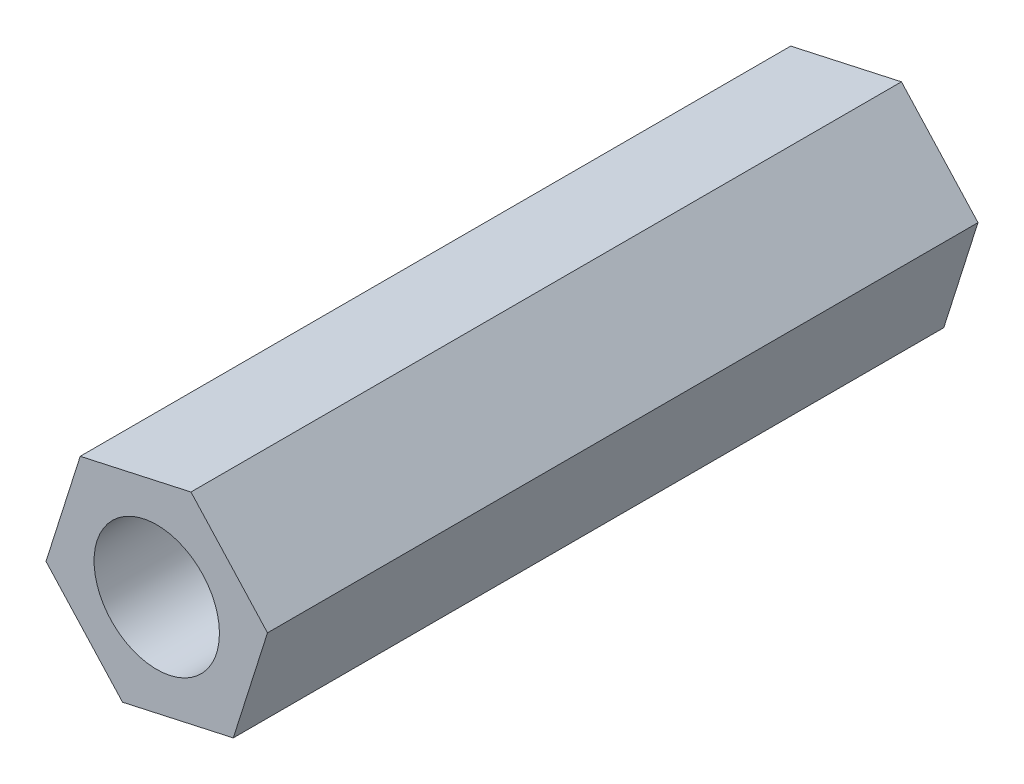
ISO-10303-21;
HEADER;
FILE_DESCRIPTION(('STEP AP214'),'2;1');
FILE_NAME('part.step','',(''),(''),'','','');
FILE_SCHEMA(('AUTOMOTIVE_DESIGN { 1 0 10303 214 1 1 1 1 }'));
ENDSEC;
DATA;
#1=APPLICATION_CONTEXT('core data for automotive mechanical design processes');
#2=APPLICATION_PROTOCOL_DEFINITION('international standard','automotive_design',2000,#1);
#3=PRODUCT_CONTEXT('',#1,'mechanical');
#4=PRODUCT('Part','Part','',(#3));
#5=PRODUCT_RELATED_PRODUCT_CATEGORY('part','',(#4));
#6=PRODUCT_DEFINITION_FORMATION('','',#4);
#7=PRODUCT_DEFINITION_CONTEXT('part definition',#1,'design');
#8=PRODUCT_DEFINITION('design','',#6,#7);
#9=PRODUCT_DEFINITION_SHAPE('','',#8);
#10=(LENGTH_UNIT() NAMED_UNIT(*) SI_UNIT(.MILLI.,.METRE.));
#11=(NAMED_UNIT(*) PLANE_ANGLE_UNIT() SI_UNIT($,.RADIAN.));
#12=(NAMED_UNIT(*) SI_UNIT($,.STERADIAN.) SOLID_ANGLE_UNIT());
#13=UNCERTAINTY_MEASURE_WITH_UNIT(LENGTH_MEASURE(1.E-05),#10,'distance_accuracy_value','');
#14=(GEOMETRIC_REPRESENTATION_CONTEXT(3) GLOBAL_UNCERTAINTY_ASSIGNED_CONTEXT((#13)) GLOBAL_UNIT_ASSIGNED_CONTEXT((#10,
#11,#12)) REPRESENTATION_CONTEXT('',''));
#15=CARTESIAN_POINT('',(0.,0.,0.));
#16=DIRECTION('',(0.,0.,1.));
#17=DIRECTION('',(1.,0.,0.));
#18=AXIS2_PLACEMENT_3D('',#15,#16,#17);
#19=CARTESIAN_POINT('',(0.,0.,17.));
#20=DIRECTION('',(0.,0.,1.));
#21=DIRECTION('',(1.,0.,0.));
#22=AXIS2_PLACEMENT_3D('',#19,#20,#21);
#23=PLANE('',#22);
#24=DIRECTION('',(0.301648882780597,0.953419084934436,0.));
#25=VECTOR('',#24,1.);
#26=CARTESIAN_POINT('',(1.83126574996171,-2.00244827307736,17.));
#27=LINE('',#26,#25);
#28=CARTESIAN_POINT('',(1.83126574996171,-2.00244827307736,17.));
#29=VERTEX_POINT('',#28);
#30=CARTESIAN_POINT('',(2.64980394923012,0.584698524008543,17.));
#31=VERTEX_POINT('',#30);
#32=EDGE_CURVE('E132',#29,#31,#27,.T.);
#33=ORIENTED_EDGE('',*,*,#32,.T.);
#34=DIRECTION('',(-0.674860706615837,0.737945137978409,0.));
#35=VECTOR('',#34,1.);
#36=CARTESIAN_POINT('',(2.64980394923012,0.584698524008543,17.));
#37=LINE('',#36,#35);
#38=CARTESIAN_POINT('',(0.818538199268401,2.58714679708588,17.));
#39=VERTEX_POINT('',#38);
#40=EDGE_CURVE('E90',#31,#39,#37,.T.);
#41=ORIENTED_EDGE('',*,*,#40,.T.);
#42=DIRECTION('',(-0.976509589396434,-0.215473946956026,0.));
#43=VECTOR('',#42,1.);
#44=CARTESIAN_POINT('',(0.818538199268401,2.58714679708588,17.));
#45=LINE('',#44,#43);
#46=CARTESIAN_POINT('',(-1.8312657499617,2.00244827307734,17.));
#47=VERTEX_POINT('',#46);
#48=EDGE_CURVE('E103',#39,#47,#45,.T.);
#49=ORIENTED_EDGE('',*,*,#48,.T.);
#50=DIRECTION('',(-0.301648882780597,-0.953419084934436,0.));
#51=VECTOR('',#50,1.);
#52=CARTESIAN_POINT('',(-1.8312657499617,2.00244827307734,17.));
#53=LINE('',#52,#51);
#54=CARTESIAN_POINT('',(-2.6498039492301,-0.584698524008529,17.));
#55=VERTEX_POINT('',#54);
#56=EDGE_CURVE('E97',#47,#55,#53,.T.);
#57=ORIENTED_EDGE('',*,*,#56,.T.);
#58=DIRECTION('',(0.674860706615837,-0.737945137978409,0.));
#59=VECTOR('',#58,1.);
#60=CARTESIAN_POINT('',(-2.6498039492301,-0.584698524008529,17.));
#61=LINE('',#60,#59);
#62=CARTESIAN_POINT('',(-0.818538199268357,-2.58714679708589,17.));
#63=VERTEX_POINT('',#62);
#64=EDGE_CURVE('E101',#55,#63,#61,.T.);
#65=ORIENTED_EDGE('',*,*,#64,.T.);
#66=DIRECTION('',(0.976509589396434,0.215473946956027,0.));
#67=VECTOR('',#66,1.);
#68=CARTESIAN_POINT('',(-0.818538199268357,-2.58714679708589,17.));
#69=LINE('',#68,#67);
#70=EDGE_CURVE('E53',#63,#29,#69,.T.);
#71=ORIENTED_EDGE('',*,*,#70,.T.);
#72=EDGE_LOOP('',(#33,#41,#49,#57,#65,#71));
#73=FACE_BOUND('',#72,.T.);
#74=CARTESIAN_POINT('',(0.,0.,17.));
#75=DIRECTION('',(0.,0.,1.));
#76=DIRECTION('',(1.,0.,0.));
#77=AXIS2_PLACEMENT_3D('',#74,#75,#76);
#78=CIRCLE('',#77,1.5);
#79=CARTESIAN_POINT('',(1.5,0.,17.));
#80=VERTEX_POINT('',#79);
#81=EDGE_CURVE('E125',#80,#80,#78,.T.);
#82=ORIENTED_EDGE('',*,*,#81,.F.);
#83=EDGE_LOOP('',(#82));
#84=FACE_BOUND('',#83,.T.);
#85=ADVANCED_FACE('F36',(#73,#84),#23,.T.);
#86=CARTESIAN_POINT('',(0.,0.,0.));
#87=DIRECTION('',(0.,0.,1.));
#88=DIRECTION('',(1.,0.,0.));
#89=AXIS2_PLACEMENT_3D('',#86,#87,#88);
#90=PLANE('',#89);
#91=DIRECTION('',(0.301648882780597,0.953419084934436,0.));
#92=VECTOR('',#91,1.);
#93=CARTESIAN_POINT('',(1.83126574996171,-2.00244827307736,0.));
#94=LINE('',#93,#92);
#95=CARTESIAN_POINT('',(1.83126574996171,-2.00244827307736,0.));
#96=VERTEX_POINT('',#95);
#97=CARTESIAN_POINT('',(2.64980394923012,0.584698524008543,0.));
#98=VERTEX_POINT('',#97);
#99=EDGE_CURVE('E121',#96,#98,#94,.T.);
#100=ORIENTED_EDGE('',*,*,#99,.F.);
#101=DIRECTION('',(0.976509589396434,0.215473946956027,0.));
#102=VECTOR('',#101,1.);
#103=CARTESIAN_POINT('',(-0.818538199268357,-2.58714679708589,0.));
#104=LINE('',#103,#102);
#105=CARTESIAN_POINT('',(-0.818538199268357,-2.58714679708589,0.));
#106=VERTEX_POINT('',#105);
#107=EDGE_CURVE('E82',#106,#96,#104,.T.);
#108=ORIENTED_EDGE('',*,*,#107,.F.);
#109=DIRECTION('',(0.674860706615837,-0.737945137978409,0.));
#110=VECTOR('',#109,1.);
#111=CARTESIAN_POINT('',(-2.6498039492301,-0.584698524008529,0.));
#112=LINE('',#111,#110);
#113=CARTESIAN_POINT('',(-2.6498039492301,-0.584698524008529,0.));
#114=VERTEX_POINT('',#113);
#115=EDGE_CURVE('E76',#114,#106,#112,.T.);
#116=ORIENTED_EDGE('',*,*,#115,.F.);
#117=DIRECTION('',(-0.301648882780597,-0.953419084934436,0.));
#118=VECTOR('',#117,1.);
#119=CARTESIAN_POINT('',(-1.8312657499617,2.00244827307734,0.));
#120=LINE('',#119,#118);
#121=CARTESIAN_POINT('',(-1.8312657499617,2.00244827307734,0.));
#122=VERTEX_POINT('',#121);
#123=EDGE_CURVE('E111',#122,#114,#120,.T.);
#124=ORIENTED_EDGE('',*,*,#123,.F.);
#125=DIRECTION('',(-0.976509589396434,-0.215473946956026,0.));
#126=VECTOR('',#125,1.);
#127=CARTESIAN_POINT('',(0.818538199268401,2.58714679708588,0.));
#128=LINE('',#127,#126);
#129=CARTESIAN_POINT('',(0.818538199268401,2.58714679708588,0.));
#130=VERTEX_POINT('',#129);
#131=EDGE_CURVE('E127',#130,#122,#128,.T.);
#132=ORIENTED_EDGE('',*,*,#131,.F.);
#133=DIRECTION('',(-0.674860706615837,0.737945137978409,0.));
#134=VECTOR('',#133,1.);
#135=CARTESIAN_POINT('',(2.64980394923012,0.584698524008543,0.));
#136=LINE('',#135,#134);
#137=EDGE_CURVE('E124',#98,#130,#136,.T.);
#138=ORIENTED_EDGE('',*,*,#137,.F.);
#139=EDGE_LOOP('',(#100,#108,#116,#124,#132,#138));
#140=FACE_BOUND('',#139,.T.);
#141=CARTESIAN_POINT('',(0.,0.,0.));
#142=DIRECTION('',(0.,0.,1.));
#143=DIRECTION('',(1.,0.,0.));
#144=AXIS2_PLACEMENT_3D('',#141,#142,#143);
#145=CIRCLE('',#144,1.5);
#146=CARTESIAN_POINT('',(1.5,0.,0.));
#147=VERTEX_POINT('',#146);
#148=EDGE_CURVE('E225',#147,#147,#145,.T.);
#149=ORIENTED_EDGE('',*,*,#148,.T.);
#150=EDGE_LOOP('',(#149));
#151=FACE_BOUND('',#150,.T.);
#152=ADVANCED_FACE('F141',(#140,#151),#90,.F.);
#153=CARTESIAN_POINT('',(1.83126574996171,-2.00244827307736,17.));
#154=DIRECTION('',(-0.953419084934436,0.301648882780597,0.));
#155=DIRECTION('',(-0.301648882780597,-0.953419084934436,0.));
#156=AXIS2_PLACEMENT_3D('',#153,#154,#155);
#157=PLANE('',#156);
#158=ORIENTED_EDGE('',*,*,#99,.T.);
#159=DIRECTION('',(0.,0.,-1.));
#160=VECTOR('',#159,1.);
#161=CARTESIAN_POINT('',(2.64980394923012,0.584698524008543,17.));
#162=LINE('',#161,#160);
#163=EDGE_CURVE('E11',#31,#98,#162,.T.);
#164=ORIENTED_EDGE('',*,*,#163,.F.);
#165=ORIENTED_EDGE('',*,*,#32,.F.);
#166=DIRECTION('',(0.,0.,-1.));
#167=VECTOR('',#166,1.);
#168=CARTESIAN_POINT('',(1.83126574996171,-2.00244827307736,17.));
#169=LINE('',#168,#167);
#170=EDGE_CURVE('E117',#29,#96,#169,.T.);
#171=ORIENTED_EDGE('',*,*,#170,.T.);
#172=EDGE_LOOP('',(#158,#164,#165,#171));
#173=FACE_BOUND('',#172,.T.);
#174=ADVANCED_FACE('F38',(#173),#157,.F.);
#175=CARTESIAN_POINT('',(2.64980394923012,0.584698524008543,17.));
#176=DIRECTION('',(-0.737945137978409,-0.674860706615837,0.));
#177=DIRECTION('',(0.674860706615837,-0.737945137978409,0.));
#178=AXIS2_PLACEMENT_3D('',#175,#176,#177);
#179=PLANE('',#178);
#180=ORIENTED_EDGE('',*,*,#137,.T.);
#181=DIRECTION('',(0.,0.,-1.));
#182=VECTOR('',#181,1.);
#183=CARTESIAN_POINT('',(0.818538199268401,2.58714679708588,17.));
#184=LINE('',#183,#182);
#185=EDGE_CURVE('E45',#39,#130,#184,.T.);
#186=ORIENTED_EDGE('',*,*,#185,.F.);
#187=ORIENTED_EDGE('',*,*,#40,.F.);
#188=ORIENTED_EDGE('',*,*,#163,.T.);
#189=EDGE_LOOP('',(#180,#186,#187,#188));
#190=FACE_BOUND('',#189,.T.);
#191=ADVANCED_FACE('F166',(#190),#179,.F.);
#192=CARTESIAN_POINT('',(0.818538199268401,2.58714679708588,17.));
#193=DIRECTION('',(0.215473946956026,-0.976509589396434,0.));
#194=DIRECTION('',(0.976509589396434,0.215473946956026,0.));
#195=AXIS2_PLACEMENT_3D('',#192,#193,#194);
#196=PLANE('',#195);
#197=ORIENTED_EDGE('',*,*,#131,.T.);
#198=DIRECTION('',(0.,0.,-1.));
#199=VECTOR('',#198,1.);
#200=CARTESIAN_POINT('',(-1.8312657499617,2.00244827307734,17.));
#201=LINE('',#200,#199);
#202=EDGE_CURVE('E112',#47,#122,#201,.T.);
#203=ORIENTED_EDGE('',*,*,#202,.F.);
#204=ORIENTED_EDGE('',*,*,#48,.F.);
#205=ORIENTED_EDGE('',*,*,#185,.T.);
#206=EDGE_LOOP('',(#197,#203,#204,#205));
#207=FACE_BOUND('',#206,.T.);
#208=ADVANCED_FACE('F138',(#207),#196,.F.);
#209=CARTESIAN_POINT('',(-1.8312657499617,2.00244827307734,17.));
#210=DIRECTION('',(0.953419084934436,-0.301648882780597,0.));
#211=DIRECTION('',(0.301648882780597,0.953419084934436,0.));
#212=AXIS2_PLACEMENT_3D('',#209,#210,#211);
#213=PLANE('',#212);
#214=ORIENTED_EDGE('',*,*,#123,.T.);
#215=DIRECTION('',(0.,0.,-1.));
#216=VECTOR('',#215,1.);
#217=CARTESIAN_POINT('',(-2.6498039492301,-0.584698524008529,17.));
#218=LINE('',#217,#216);
#219=EDGE_CURVE('E108',#55,#114,#218,.T.);
#220=ORIENTED_EDGE('',*,*,#219,.F.);
#221=ORIENTED_EDGE('',*,*,#56,.F.);
#222=ORIENTED_EDGE('',*,*,#202,.T.);
#223=EDGE_LOOP('',(#214,#220,#221,#222));
#224=FACE_BOUND('',#223,.T.);
#225=ADVANCED_FACE('F109',(#224),#213,.F.);
#226=CARTESIAN_POINT('',(-2.6498039492301,-0.584698524008529,17.));
#227=DIRECTION('',(0.737945137978409,0.674860706615837,0.));
#228=DIRECTION('',(-0.674860706615837,0.737945137978409,0.));
#229=AXIS2_PLACEMENT_3D('',#226,#227,#228);
#230=PLANE('',#229);
#231=ORIENTED_EDGE('',*,*,#115,.T.);
#232=DIRECTION('',(0.,0.,-1.));
#233=VECTOR('',#232,1.);
#234=CARTESIAN_POINT('',(-0.818538199268357,-2.58714679708589,17.));
#235=LINE('',#234,#233);
#236=EDGE_CURVE('E113',#63,#106,#235,.T.);
#237=ORIENTED_EDGE('',*,*,#236,.F.);
#238=ORIENTED_EDGE('',*,*,#64,.F.);
#239=ORIENTED_EDGE('',*,*,#219,.T.);
#240=EDGE_LOOP('',(#231,#237,#238,#239));
#241=FACE_BOUND('',#240,.T.);
#242=ADVANCED_FACE('F115',(#241),#230,.F.);
#243=CARTESIAN_POINT('',(-0.818538199268357,-2.58714679708589,17.));
#244=DIRECTION('',(-0.215473946956027,0.976509589396434,0.));
#245=DIRECTION('',(-0.976509589396434,-0.215473946956027,0.));
#246=AXIS2_PLACEMENT_3D('',#243,#244,#245);
#247=PLANE('',#246);
#248=ORIENTED_EDGE('',*,*,#107,.T.);
#249=ORIENTED_EDGE('',*,*,#170,.F.);
#250=ORIENTED_EDGE('',*,*,#70,.F.);
#251=ORIENTED_EDGE('',*,*,#236,.T.);
#252=EDGE_LOOP('',(#248,#249,#250,#251));
#253=FACE_BOUND('',#252,.T.);
#254=ADVANCED_FACE('F146',(#253),#247,.F.);
#255=CARTESIAN_POINT('',(0.,0.,17.));
#256=DIRECTION('',(0.,0.,-1.));
#257=DIRECTION('',(-1.,0.,0.));
#258=AXIS2_PLACEMENT_3D('',#255,#256,#257);
#259=CYLINDRICAL_SURFACE('',#258,1.5);
#260=ORIENTED_EDGE('',*,*,#81,.T.);
#261=EDGE_LOOP('',(#260));
#262=FACE_BOUND('',#261,.T.);
#263=ORIENTED_EDGE('',*,*,#148,.F.);
#264=EDGE_LOOP('',(#263));
#265=FACE_BOUND('',#264,.T.);
#266=ADVANCED_FACE('F148',(#262,#265),#259,.F.);
#267=CLOSED_SHELL('',(#85,#152,#174,#191,#208,#225,#242,#254,#266));
#268=MANIFOLD_SOLID_BREP('B2',#267);
#269=ADVANCED_BREP_SHAPE_REPRESENTATION('',(#18,#268),#14);
#270=SHAPE_DEFINITION_REPRESENTATION(#9,#269);
ENDSEC;
END-ISO-10303-21;
